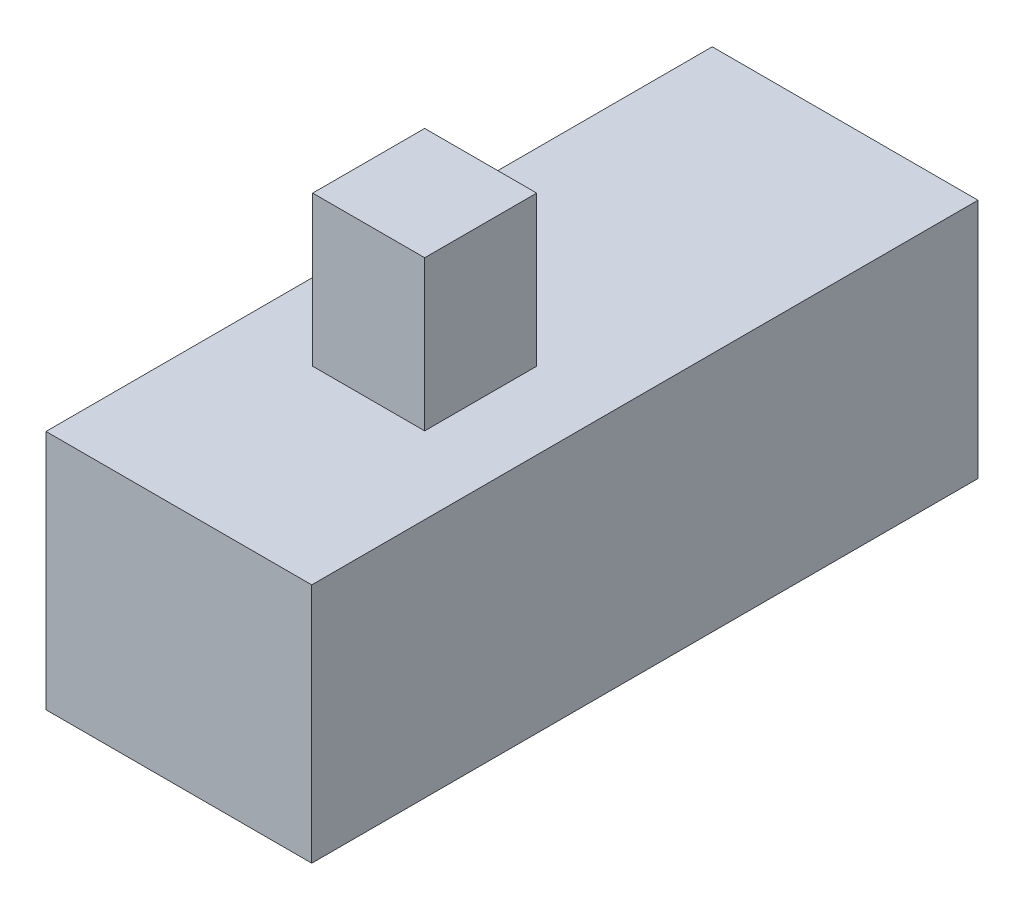
ISO-10303-21;
HEADER;
FILE_DESCRIPTION(('STEP AP214'),'2;1');
FILE_NAME('part.step','',(''),(''),'','','');
FILE_SCHEMA(('AUTOMOTIVE_DESIGN { 1 0 10303 214 1 1 1 1 }'));
ENDSEC;
DATA;
#1=APPLICATION_CONTEXT('core data for automotive mechanical design processes');
#2=APPLICATION_PROTOCOL_DEFINITION('international standard','automotive_design',2000,#1);
#3=PRODUCT_CONTEXT('',#1,'mechanical');
#4=PRODUCT('Part','Part','',(#3));
#5=PRODUCT_RELATED_PRODUCT_CATEGORY('part','',(#4));
#6=PRODUCT_DEFINITION_FORMATION('','',#4);
#7=PRODUCT_DEFINITION_CONTEXT('part definition',#1,'design');
#8=PRODUCT_DEFINITION('design','',#6,#7);
#9=PRODUCT_DEFINITION_SHAPE('','',#8);
#10=(LENGTH_UNIT() NAMED_UNIT(*) SI_UNIT(.MILLI.,.METRE.));
#11=(NAMED_UNIT(*) PLANE_ANGLE_UNIT() SI_UNIT($,.RADIAN.));
#12=(NAMED_UNIT(*) SI_UNIT($,.STERADIAN.) SOLID_ANGLE_UNIT());
#13=UNCERTAINTY_MEASURE_WITH_UNIT(LENGTH_MEASURE(1.E-05),#10,'distance_accuracy_value','');
#14=(GEOMETRIC_REPRESENTATION_CONTEXT(3) GLOBAL_UNCERTAINTY_ASSIGNED_CONTEXT((#13)) GLOBAL_UNIT_ASSIGNED_CONTEXT((#10,
#11,#12)) REPRESENTATION_CONTEXT('',''));
#15=CARTESIAN_POINT('',(0.,0.,0.));
#16=DIRECTION('',(0.,0.,1.));
#17=DIRECTION('',(1.,0.,0.));
#18=AXIS2_PLACEMENT_3D('',#15,#16,#17);
#19=CARTESIAN_POINT('',(-19.9060752324941,3.2258,-35.3336467517488));
#20=DIRECTION('',(0.,1.,0.));
#21=DIRECTION('',(0.,0.,1.));
#22=AXIS2_PLACEMENT_3D('',#19,#20,#21);
#23=PLANE('',#22);
#24=DIRECTION('',(0.,0.,1.));
#25=VECTOR('',#24,1.);
#26=CARTESIAN_POINT('',(-19.906075232494,3.2258,-44.2490467517488));
#27=LINE('',#26,#25);
#28=CARTESIAN_POINT('',(-19.906075232494,3.2258,-44.2490467517488));
#29=VERTEX_POINT('',#28);
#30=CARTESIAN_POINT('',(-19.9060752324941,3.2258,-35.3336467517488));
#31=VERTEX_POINT('',#30);
#32=EDGE_CURVE('E139',#29,#31,#27,.T.);
#33=ORIENTED_EDGE('',*,*,#32,.T.);
#34=DIRECTION('',(1.,0.,0.));
#35=VECTOR('',#34,1.);
#36=CARTESIAN_POINT('',(-19.9060752324941,3.2258,-35.3336467517488));
#37=LINE('',#36,#35);
#38=CARTESIAN_POINT('',(-16.3500752324941,3.2258,-35.3336467517488));
#39=VERTEX_POINT('',#38);
#40=EDGE_CURVE('E84',#31,#39,#37,.T.);
#41=ORIENTED_EDGE('',*,*,#40,.T.);
#42=DIRECTION('',(0.,0.,-1.));
#43=VECTOR('',#42,1.);
#44=CARTESIAN_POINT('',(-16.3500752324941,3.2258,-44.2490467517488));
#45=LINE('',#44,#43);
#46=CARTESIAN_POINT('',(-16.3500752324941,3.2258,-44.2490467517488));
#47=VERTEX_POINT('',#46);
#48=EDGE_CURVE('E142',#39,#47,#45,.T.);
#49=ORIENTED_EDGE('',*,*,#48,.T.);
#50=DIRECTION('',(-1.,0.,0.));
#51=VECTOR('',#50,1.);
#52=CARTESIAN_POINT('',(-19.906075232494,3.2258,-44.2490467517488));
#53=LINE('',#52,#51);
#54=EDGE_CURVE('E56',#47,#29,#53,.T.);
#55=ORIENTED_EDGE('',*,*,#54,.T.);
#56=EDGE_LOOP('',(#33,#41,#49,#55));
#57=FACE_BOUND('',#56,.T.);
#58=DIRECTION('',(1.,0.,0.));
#59=VECTOR('',#58,1.);
#60=CARTESIAN_POINT('',(-18.8773752324941,3.2258,-37.8736467517488));
#61=LINE('',#60,#59);
#62=CARTESIAN_POINT('',(-18.8773752324941,3.2258,-37.8736467517488));
#63=VERTEX_POINT('',#62);
#64=CARTESIAN_POINT('',(-17.378775232494,3.2258,-37.8736467517488));
#65=VERTEX_POINT('',#64);
#66=EDGE_CURVE('E262',#63,#65,#61,.T.);
#67=ORIENTED_EDGE('',*,*,#66,.F.);
#68=DIRECTION('',(0.,0.,1.));
#69=VECTOR('',#68,1.);
#70=CARTESIAN_POINT('',(-18.8773752324941,3.2258,-39.3722467517488));
#71=LINE('',#70,#69);
#72=CARTESIAN_POINT('',(-18.8773752324941,3.2258,-39.3722467517488));
#73=VERTEX_POINT('',#72);
#74=EDGE_CURVE('E129',#73,#63,#71,.T.);
#75=ORIENTED_EDGE('',*,*,#74,.F.);
#76=DIRECTION('',(-1.,0.,0.));
#77=VECTOR('',#76,1.);
#78=CARTESIAN_POINT('',(-18.8773752324941,3.2258,-39.3722467517488));
#79=LINE('',#78,#77);
#80=CARTESIAN_POINT('',(-17.378775232494,3.2258,-39.3722467517488));
#81=VERTEX_POINT('',#80);
#82=EDGE_CURVE('E125',#81,#73,#79,.T.);
#83=ORIENTED_EDGE('',*,*,#82,.F.);
#84=DIRECTION('',(0.,0.,-1.));
#85=VECTOR('',#84,1.);
#86=CARTESIAN_POINT('',(-17.378775232494,3.2258,-39.3722467517488));
#87=LINE('',#86,#85);
#88=EDGE_CURVE('E259',#65,#81,#87,.T.);
#89=ORIENTED_EDGE('',*,*,#88,.F.);
#90=EDGE_LOOP('',(#67,#75,#83,#89));
#91=FACE_BOUND('',#90,.T.);
#92=ADVANCED_FACE('F32',(#57,#91),#23,.T.);
#93=CARTESIAN_POINT('',(-19.906075232494,3.2258,-44.2490467517488));
#94=DIRECTION('',(1.,0.,0.));
#95=DIRECTION('',(0.,0.,-1.));
#96=AXIS2_PLACEMENT_3D('',#93,#94,#95);
#97=PLANE('',#96);
#98=DIRECTION('',(0.,0.,1.));
#99=VECTOR('',#98,1.);
#100=CARTESIAN_POINT('',(-19.906075232494,0.,-44.2490467517488));
#101=LINE('',#100,#99);
#102=CARTESIAN_POINT('',(-19.906075232494,0.,-44.2490467517488));
#103=VERTEX_POINT('',#102);
#104=CARTESIAN_POINT('',(-19.9060752324941,0.,-35.3336467517488));
#105=VERTEX_POINT('',#104);
#106=EDGE_CURVE('E131',#103,#105,#101,.T.);
#107=ORIENTED_EDGE('',*,*,#106,.T.);
#108=DIRECTION('',(0.,-1.,0.));
#109=VECTOR('',#108,1.);
#110=CARTESIAN_POINT('',(-19.9060752324941,3.2258,-35.3336467517488));
#111=LINE('',#110,#109);
#112=EDGE_CURVE('E11',#31,#105,#111,.T.);
#113=ORIENTED_EDGE('',*,*,#112,.F.);
#114=ORIENTED_EDGE('',*,*,#32,.F.);
#115=DIRECTION('',(0.,-1.,0.));
#116=VECTOR('',#115,1.);
#117=CARTESIAN_POINT('',(-19.906075232494,3.2258,-44.2490467517488));
#118=LINE('',#117,#116);
#119=EDGE_CURVE('E144',#29,#103,#118,.T.);
#120=ORIENTED_EDGE('',*,*,#119,.T.);
#121=EDGE_LOOP('',(#107,#113,#114,#120));
#122=FACE_BOUND('',#121,.T.);
#123=ADVANCED_FACE('F34',(#122),#97,.F.);
#124=CARTESIAN_POINT('',(-19.9060752324941,3.2258,-35.3336467517488));
#125=DIRECTION('',(0.,0.,-1.));
#126=DIRECTION('',(-1.,0.,0.));
#127=AXIS2_PLACEMENT_3D('',#124,#125,#126);
#128=PLANE('',#127);
#129=DIRECTION('',(1.,0.,0.));
#130=VECTOR('',#129,1.);
#131=CARTESIAN_POINT('',(-19.9060752324941,0.,-35.3336467517488));
#132=LINE('',#131,#130);
#133=CARTESIAN_POINT('',(-16.3500752324941,0.,-35.3336467517488));
#134=VERTEX_POINT('',#133);
#135=EDGE_CURVE('E134',#105,#134,#132,.T.);
#136=ORIENTED_EDGE('',*,*,#135,.T.);
#137=DIRECTION('',(0.,-1.,0.));
#138=VECTOR('',#137,1.);
#139=CARTESIAN_POINT('',(-16.3500752324941,3.2258,-35.3336467517488));
#140=LINE('',#139,#138);
#141=EDGE_CURVE('E40',#39,#134,#140,.T.);
#142=ORIENTED_EDGE('',*,*,#141,.F.);
#143=ORIENTED_EDGE('',*,*,#40,.F.);
#144=ORIENTED_EDGE('',*,*,#112,.T.);
#145=EDGE_LOOP('',(#136,#142,#143,#144));
#146=FACE_BOUND('',#145,.T.);
#147=ADVANCED_FACE('F172',(#146),#128,.F.);
#148=CARTESIAN_POINT('',(-16.3500752324941,3.2258,-44.2490467517488));
#149=DIRECTION('',(-1.,0.,0.));
#150=DIRECTION('',(0.,0.,1.));
#151=AXIS2_PLACEMENT_3D('',#148,#149,#150);
#152=PLANE('',#151);
#153=DIRECTION('',(0.,0.,-1.));
#154=VECTOR('',#153,1.);
#155=CARTESIAN_POINT('',(-16.3500752324941,0.,-44.2490467517488));
#156=LINE('',#155,#154);
#157=CARTESIAN_POINT('',(-16.3500752324941,0.,-44.2490467517488));
#158=VERTEX_POINT('',#157);
#159=EDGE_CURVE('E147',#134,#158,#156,.T.);
#160=ORIENTED_EDGE('',*,*,#159,.T.);
#161=DIRECTION('',(0.,-1.,0.));
#162=VECTOR('',#161,1.);
#163=CARTESIAN_POINT('',(-16.3500752324941,3.2258,-44.2490467517488));
#164=LINE('',#163,#162);
#165=EDGE_CURVE('E151',#47,#158,#164,.T.);
#166=ORIENTED_EDGE('',*,*,#165,.F.);
#167=ORIENTED_EDGE('',*,*,#48,.F.);
#168=ORIENTED_EDGE('',*,*,#141,.T.);
#169=EDGE_LOOP('',(#160,#166,#167,#168));
#170=FACE_BOUND('',#169,.T.);
#171=ADVANCED_FACE('F156',(#170),#152,.F.);
#172=CARTESIAN_POINT('',(-19.906075232494,3.2258,-44.2490467517488));
#173=DIRECTION('',(0.,0.,1.));
#174=DIRECTION('',(1.,0.,0.));
#175=AXIS2_PLACEMENT_3D('',#172,#173,#174);
#176=PLANE('',#175);
#177=DIRECTION('',(-1.,0.,0.));
#178=VECTOR('',#177,1.);
#179=CARTESIAN_POINT('',(-19.906075232494,0.,-44.2490467517488));
#180=LINE('',#179,#178);
#181=EDGE_CURVE('E77',#158,#103,#180,.T.);
#182=ORIENTED_EDGE('',*,*,#181,.T.);
#183=ORIENTED_EDGE('',*,*,#119,.F.);
#184=ORIENTED_EDGE('',*,*,#54,.F.);
#185=ORIENTED_EDGE('',*,*,#165,.T.);
#186=EDGE_LOOP('',(#182,#183,#184,#185));
#187=FACE_BOUND('',#186,.T.);
#188=ADVANCED_FACE('F164',(#187),#176,.F.);
#189=CARTESIAN_POINT('',(-19.9060752324941,0.,-35.3336467517488));
#190=DIRECTION('',(0.,1.,0.));
#191=DIRECTION('',(0.,0.,1.));
#192=AXIS2_PLACEMENT_3D('',#189,#190,#191);
#193=PLANE('',#192);
#194=ORIENTED_EDGE('',*,*,#106,.F.);
#195=ORIENTED_EDGE('',*,*,#181,.F.);
#196=ORIENTED_EDGE('',*,*,#159,.F.);
#197=ORIENTED_EDGE('',*,*,#135,.F.);
#198=EDGE_LOOP('',(#194,#195,#196,#197));
#199=FACE_BOUND('',#198,.T.);
#200=ADVANCED_FACE('F160',(#199),#193,.F.);
#201=CARTESIAN_POINT('',(-18.8773752324941,5.2324,-39.3722467517488));
#202=DIRECTION('',(1.,0.,0.));
#203=DIRECTION('',(0.,0.,-1.));
#204=AXIS2_PLACEMENT_3D('',#201,#202,#203);
#205=PLANE('',#204);
#206=ORIENTED_EDGE('',*,*,#74,.T.);
#207=DIRECTION('',(0.,-1.,0.));
#208=VECTOR('',#207,1.);
#209=CARTESIAN_POINT('',(-18.8773752324941,5.2324,-37.8736467517488));
#210=LINE('',#209,#208);
#211=CARTESIAN_POINT('',(-18.8773752324941,5.2324,-37.8736467517488));
#212=VERTEX_POINT('',#211);
#213=EDGE_CURVE('E110',#212,#63,#210,.T.);
#214=ORIENTED_EDGE('',*,*,#213,.F.);
#215=DIRECTION('',(0.,0.,1.));
#216=VECTOR('',#215,1.);
#217=CARTESIAN_POINT('',(-18.8773752324941,5.2324,-39.3722467517488));
#218=LINE('',#217,#216);
#219=CARTESIAN_POINT('',(-18.8773752324941,5.2324,-39.3722467517488));
#220=VERTEX_POINT('',#219);
#221=EDGE_CURVE('E117',#220,#212,#218,.T.);
#222=ORIENTED_EDGE('',*,*,#221,.F.);
#223=DIRECTION('',(0.,-1.,0.));
#224=VECTOR('',#223,1.);
#225=CARTESIAN_POINT('',(-18.8773752324941,5.2324,-39.3722467517488));
#226=LINE('',#225,#224);
#227=EDGE_CURVE('E257',#220,#73,#226,.T.);
#228=ORIENTED_EDGE('',*,*,#227,.T.);
#229=EDGE_LOOP('',(#206,#214,#222,#228));
#230=FACE_BOUND('',#229,.T.);
#231=ADVANCED_FACE('F127',(#230),#205,.F.);
#232=CARTESIAN_POINT('',(-18.8773752324941,5.2324,-37.8736467517488));
#233=DIRECTION('',(0.,0.,-1.));
#234=DIRECTION('',(-1.,0.,0.));
#235=AXIS2_PLACEMENT_3D('',#232,#233,#234);
#236=PLANE('',#235);
#237=ORIENTED_EDGE('',*,*,#66,.T.);
#238=DIRECTION('',(0.,-1.,0.));
#239=VECTOR('',#238,1.);
#240=CARTESIAN_POINT('',(-17.378775232494,5.2324,-37.8736467517488));
#241=LINE('',#240,#239);
#242=CARTESIAN_POINT('',(-17.378775232494,5.2324,-37.8736467517488));
#243=VERTEX_POINT('',#242);
#244=EDGE_CURVE('E113',#243,#65,#241,.T.);
#245=ORIENTED_EDGE('',*,*,#244,.F.);
#246=DIRECTION('',(1.,0.,0.));
#247=VECTOR('',#246,1.);
#248=CARTESIAN_POINT('',(-18.8773752324941,5.2324,-37.8736467517488));
#249=LINE('',#248,#247);
#250=EDGE_CURVE('E106',#212,#243,#249,.T.);
#251=ORIENTED_EDGE('',*,*,#250,.F.);
#252=ORIENTED_EDGE('',*,*,#213,.T.);
#253=EDGE_LOOP('',(#237,#245,#251,#252));
#254=FACE_BOUND('',#253,.T.);
#255=ADVANCED_FACE('F108',(#254),#236,.F.);
#256=CARTESIAN_POINT('',(-17.378775232494,5.2324,-39.3722467517488));
#257=DIRECTION('',(-1.,0.,0.));
#258=DIRECTION('',(0.,0.,1.));
#259=AXIS2_PLACEMENT_3D('',#256,#257,#258);
#260=PLANE('',#259);
#261=ORIENTED_EDGE('',*,*,#88,.T.);
#262=DIRECTION('',(0.,-1.,0.));
#263=VECTOR('',#262,1.);
#264=CARTESIAN_POINT('',(-17.378775232494,5.2324,-39.3722467517488));
#265=LINE('',#264,#263);
#266=CARTESIAN_POINT('',(-17.378775232494,5.2324,-39.3722467517488));
#267=VERTEX_POINT('',#266);
#268=EDGE_CURVE('E47',#267,#81,#265,.T.);
#269=ORIENTED_EDGE('',*,*,#268,.F.);
#270=DIRECTION('',(0.,0.,-1.));
#271=VECTOR('',#270,1.);
#272=CARTESIAN_POINT('',(-17.378775232494,5.2324,-39.3722467517488));
#273=LINE('',#272,#271);
#274=EDGE_CURVE('E116',#243,#267,#273,.T.);
#275=ORIENTED_EDGE('',*,*,#274,.F.);
#276=ORIENTED_EDGE('',*,*,#244,.T.);
#277=EDGE_LOOP('',(#261,#269,#275,#276));
#278=FACE_BOUND('',#277,.T.);
#279=ADVANCED_FACE('F185',(#278),#260,.F.);
#280=CARTESIAN_POINT('',(-18.8773752324941,5.2324,-39.3722467517488));
#281=DIRECTION('',(0.,0.,1.));
#282=DIRECTION('',(1.,0.,0.));
#283=AXIS2_PLACEMENT_3D('',#280,#281,#282);
#284=PLANE('',#283);
#285=ORIENTED_EDGE('',*,*,#82,.T.);
#286=ORIENTED_EDGE('',*,*,#227,.F.);
#287=DIRECTION('',(-1.,0.,0.));
#288=VECTOR('',#287,1.);
#289=CARTESIAN_POINT('',(-18.8773752324941,5.2324,-39.3722467517488));
#290=LINE('',#289,#288);
#291=EDGE_CURVE('E121',#267,#220,#290,.T.);
#292=ORIENTED_EDGE('',*,*,#291,.F.);
#293=ORIENTED_EDGE('',*,*,#268,.T.);
#294=EDGE_LOOP('',(#285,#286,#292,#293));
#295=FACE_BOUND('',#294,.T.);
#296=ADVANCED_FACE('F188',(#295),#284,.F.);
#297=CARTESIAN_POINT('',(-18.8773752324941,5.2324,-37.8736467517488));
#298=DIRECTION('',(0.,1.,0.));
#299=DIRECTION('',(0.,0.,1.));
#300=AXIS2_PLACEMENT_3D('',#297,#298,#299);
#301=PLANE('',#300);
#302=ORIENTED_EDGE('',*,*,#221,.T.);
#303=ORIENTED_EDGE('',*,*,#250,.T.);
#304=ORIENTED_EDGE('',*,*,#274,.T.);
#305=ORIENTED_EDGE('',*,*,#291,.T.);
#306=EDGE_LOOP('',(#302,#303,#304,#305));
#307=FACE_BOUND('',#306,.T.);
#308=ADVANCED_FACE('F120',(#307),#301,.T.);
#309=CLOSED_SHELL('',(#92,#123,#147,#171,#188,#200,#231,#255,#279,#296,#308));
#310=MANIFOLD_SOLID_BREP('B2',#309);
#311=ADVANCED_BREP_SHAPE_REPRESENTATION('',(#18,#310),#14);
#312=SHAPE_DEFINITION_REPRESENTATION(#9,#311);
ENDSEC;
END-ISO-10303-21;
